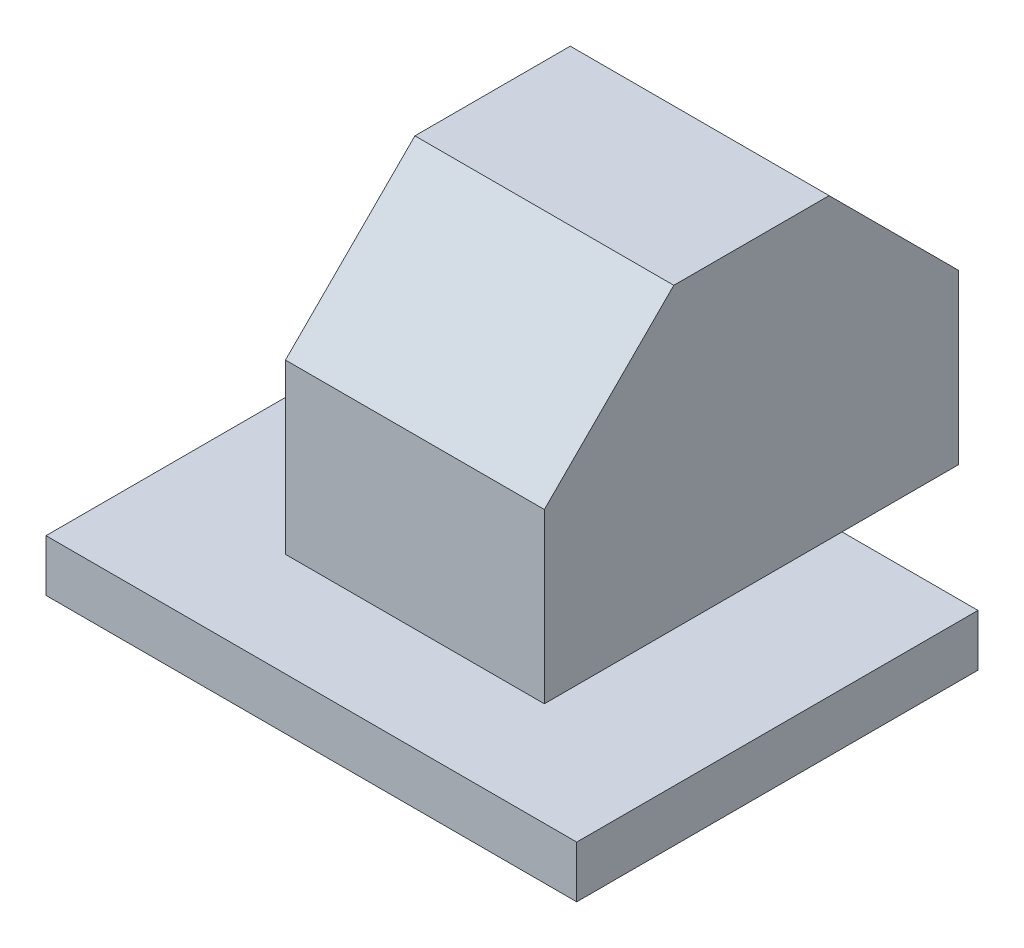
ISO-10303-21;
HEADER;
FILE_DESCRIPTION(('STEP AP214'),'2;1');
FILE_NAME('part.step','',(''),(''),'','','');
FILE_SCHEMA(('AUTOMOTIVE_DESIGN { 1 0 10303 214 1 1 1 1 }'));
ENDSEC;
DATA;
#1=APPLICATION_CONTEXT('core data for automotive mechanical design processes');
#2=APPLICATION_PROTOCOL_DEFINITION('international standard','automotive_design',2000,#1);
#3=PRODUCT_CONTEXT('',#1,'mechanical');
#4=PRODUCT('Part','Part','',(#3));
#5=PRODUCT_RELATED_PRODUCT_CATEGORY('part','',(#4));
#6=PRODUCT_DEFINITION_FORMATION('','',#4);
#7=PRODUCT_DEFINITION_CONTEXT('part definition',#1,'design');
#8=PRODUCT_DEFINITION('design','',#6,#7);
#9=PRODUCT_DEFINITION_SHAPE('','',#8);
#10=(LENGTH_UNIT() NAMED_UNIT(*) SI_UNIT(.MILLI.,.METRE.));
#11=(NAMED_UNIT(*) PLANE_ANGLE_UNIT() SI_UNIT($,.RADIAN.));
#12=(NAMED_UNIT(*) SI_UNIT($,.STERADIAN.) SOLID_ANGLE_UNIT());
#13=UNCERTAINTY_MEASURE_WITH_UNIT(LENGTH_MEASURE(1.E-05),#10,'distance_accuracy_value','');
#14=(GEOMETRIC_REPRESENTATION_CONTEXT(3) GLOBAL_UNCERTAINTY_ASSIGNED_CONTEXT((#13)) GLOBAL_UNIT_ASSIGNED_CONTEXT((#10,
#11,#12)) REPRESENTATION_CONTEXT('',''));
#15=CARTESIAN_POINT('',(0.,0.,0.));
#16=DIRECTION('',(0.,0.,1.));
#17=DIRECTION('',(1.,0.,0.));
#18=AXIS2_PLACEMENT_3D('',#15,#16,#17);
#19=CARTESIAN_POINT('',(0.,2.,0.));
#20=DIRECTION('',(0.,-1.,0.));
#21=DIRECTION('',(0.,0.,-1.));
#22=AXIS2_PLACEMENT_3D('',#19,#20,#21);
#23=PLANE('',#22);
#24=CARTESIAN_POINT('',(-8.64441072293235,2.,-4.98118974526797));
#25=DIRECTION('',(0.,-1.,0.));
#26=DIRECTION('',(0.,0.,-1.));
#27=AXIS2_PLACEMENT_3D('',#24,#25,#26);
#28=CIRCLE('',#27,1.43812907012534);
#29=CARTESIAN_POINT('',(-8.64441072293235,2.,-6.41931881539331));
#30=VERTEX_POINT('',#29);
#31=EDGE_CURVE('E194',#30,#30,#28,.F.);
#32=ORIENTED_EDGE('',*,*,#31,.F.);
#33=EDGE_LOOP('',(#32));
#34=FACE_BOUND('',#33,.T.);
#35=DIRECTION('',(0.,0.,1.));
#36=VECTOR('',#35,1.);
#37=CARTESIAN_POINT('',(-5.,2.,3.75));
#38=LINE('',#37,#36);
#39=CARTESIAN_POINT('',(-5.,2.,-7.75));
#40=VERTEX_POINT('',#39);
#41=CARTESIAN_POINT('',(-5.,2.,3.75));
#42=VERTEX_POINT('',#41);
#43=EDGE_CURVE('E152',#40,#42,#38,.T.);
#44=ORIENTED_EDGE('',*,*,#43,.F.);
#45=DIRECTION('',(-1.,0.,0.));
#46=VECTOR('',#45,1.);
#47=CARTESIAN_POINT('',(10.25,2.,-7.75));
#48=LINE('',#47,#46);
#49=CARTESIAN_POINT('',(-10.25,2.,-7.75));
#50=VERTEX_POINT('',#49);
#51=EDGE_CURVE('E172',#40,#50,#48,.T.);
#52=ORIENTED_EDGE('',*,*,#51,.T.);
#53=DIRECTION('',(0.,0.,1.));
#54=VECTOR('',#53,1.);
#55=CARTESIAN_POINT('',(-10.25,2.,-7.75));
#56=LINE('',#55,#54);
#57=CARTESIAN_POINT('',(-10.25,2.,7.75));
#58=VERTEX_POINT('',#57);
#59=EDGE_CURVE('E164',#50,#58,#56,.T.);
#60=ORIENTED_EDGE('',*,*,#59,.T.);
#61=DIRECTION('',(1.,0.,0.));
#62=VECTOR('',#61,1.);
#63=CARTESIAN_POINT('',(10.25,2.,7.75));
#64=LINE('',#63,#62);
#65=CARTESIAN_POINT('',(10.25,2.,7.75));
#66=VERTEX_POINT('',#65);
#67=EDGE_CURVE('E167',#58,#66,#64,.T.);
#68=ORIENTED_EDGE('',*,*,#67,.T.);
#69=DIRECTION('',(0.,0.,-1.));
#70=VECTOR('',#69,1.);
#71=CARTESIAN_POINT('',(10.25,2.,-7.75));
#72=LINE('',#71,#70);
#73=CARTESIAN_POINT('',(10.25,2.,-7.75));
#74=VERTEX_POINT('',#73);
#75=EDGE_CURVE('E170',#66,#74,#72,.T.);
#76=ORIENTED_EDGE('',*,*,#75,.T.);
#77=CARTESIAN_POINT('',(5.,2.,-7.75));
#78=VERTEX_POINT('',#77);
#79=EDGE_CURVE('E140',#74,#78,#48,.T.);
#80=ORIENTED_EDGE('',*,*,#79,.T.);
#81=DIRECTION('',(0.,0.,-1.));
#82=VECTOR('',#81,1.);
#83=CARTESIAN_POINT('',(5.,2.,3.75));
#84=LINE('',#83,#82);
#85=CARTESIAN_POINT('',(5.,2.,3.75));
#86=VERTEX_POINT('',#85);
#87=EDGE_CURVE('E127',#86,#78,#84,.T.);
#88=ORIENTED_EDGE('',*,*,#87,.F.);
#89=DIRECTION('',(1.,0.,0.));
#90=VECTOR('',#89,1.);
#91=CARTESIAN_POINT('',(5.,2.,3.75));
#92=LINE('',#91,#90);
#93=EDGE_CURVE('E137',#42,#86,#92,.T.);
#94=ORIENTED_EDGE('',*,*,#93,.F.);
#95=EDGE_LOOP('',(#44,#52,#60,#68,#76,#80,#88,#94));
#96=FACE_BOUND('',#95,.T.);
#97=ADVANCED_FACE('F41',(#34,#96),#23,.F.);
#98=CARTESIAN_POINT('',(-10.25,2.,-7.75));
#99=DIRECTION('',(1.,0.,0.));
#100=DIRECTION('',(0.,0.,-1.));
#101=AXIS2_PLACEMENT_3D('',#98,#99,#100);
#102=PLANE('',#101);
#103=DIRECTION('',(0.,0.,1.));
#104=VECTOR('',#103,1.);
#105=CARTESIAN_POINT('',(-10.25,0.,-7.75));
#106=LINE('',#105,#104);
#107=CARTESIAN_POINT('',(-10.25,0.,-7.75));
#108=VERTEX_POINT('',#107);
#109=CARTESIAN_POINT('',(-10.25,0.,7.75));
#110=VERTEX_POINT('',#109);
#111=EDGE_CURVE('E163',#108,#110,#106,.T.);
#112=ORIENTED_EDGE('',*,*,#111,.T.);
#113=DIRECTION('',(0.,-1.,0.));
#114=VECTOR('',#113,1.);
#115=CARTESIAN_POINT('',(-10.25,2.,7.75));
#116=LINE('',#115,#114);
#117=EDGE_CURVE('E191',#58,#110,#116,.T.);
#118=ORIENTED_EDGE('',*,*,#117,.F.);
#119=ORIENTED_EDGE('',*,*,#59,.F.);
#120=DIRECTION('',(0.,-1.,0.));
#121=VECTOR('',#120,1.);
#122=CARTESIAN_POINT('',(-10.25,2.,-7.75));
#123=LINE('',#122,#121);
#124=EDGE_CURVE('E174',#50,#108,#123,.T.);
#125=ORIENTED_EDGE('',*,*,#124,.T.);
#126=EDGE_LOOP('',(#112,#118,#119,#125));
#127=FACE_BOUND('',#126,.T.);
#128=ADVANCED_FACE('F236',(#127),#102,.F.);
#129=CARTESIAN_POINT('',(10.25,2.,7.75));
#130=DIRECTION('',(0.,0.,-1.));
#131=DIRECTION('',(-1.,0.,0.));
#132=AXIS2_PLACEMENT_3D('',#129,#130,#131);
#133=PLANE('',#132);
#134=DIRECTION('',(1.,0.,0.));
#135=VECTOR('',#134,1.);
#136=CARTESIAN_POINT('',(10.25,0.,7.75));
#137=LINE('',#136,#135);
#138=CARTESIAN_POINT('',(10.25,0.,7.75));
#139=VERTEX_POINT('',#138);
#140=EDGE_CURVE('E178',#110,#139,#137,.T.);
#141=ORIENTED_EDGE('',*,*,#140,.T.);
#142=DIRECTION('',(0.,-1.,0.));
#143=VECTOR('',#142,1.);
#144=CARTESIAN_POINT('',(10.25,2.,7.75));
#145=LINE('',#144,#143);
#146=EDGE_CURVE('E188',#66,#139,#145,.T.);
#147=ORIENTED_EDGE('',*,*,#146,.F.);
#148=ORIENTED_EDGE('',*,*,#67,.F.);
#149=ORIENTED_EDGE('',*,*,#117,.T.);
#150=EDGE_LOOP('',(#141,#147,#148,#149));
#151=FACE_BOUND('',#150,.T.);
#152=ADVANCED_FACE('F241',(#151),#133,.F.);
#153=CARTESIAN_POINT('',(10.25,2.,-7.75));
#154=DIRECTION('',(-1.,0.,0.));
#155=DIRECTION('',(0.,0.,1.));
#156=AXIS2_PLACEMENT_3D('',#153,#154,#155);
#157=PLANE('',#156);
#158=DIRECTION('',(0.,0.,-1.));
#159=VECTOR('',#158,1.);
#160=CARTESIAN_POINT('',(10.25,0.,-7.75));
#161=LINE('',#160,#159);
#162=CARTESIAN_POINT('',(10.25,0.,-7.75));
#163=VERTEX_POINT('',#162);
#164=EDGE_CURVE('E180',#139,#163,#161,.T.);
#165=ORIENTED_EDGE('',*,*,#164,.T.);
#166=DIRECTION('',(0.,-1.,0.));
#167=VECTOR('',#166,1.);
#168=CARTESIAN_POINT('',(10.25,2.,-7.75));
#169=LINE('',#168,#167);
#170=EDGE_CURVE('E185',#74,#163,#169,.T.);
#171=ORIENTED_EDGE('',*,*,#170,.F.);
#172=ORIENTED_EDGE('',*,*,#75,.F.);
#173=ORIENTED_EDGE('',*,*,#146,.T.);
#174=EDGE_LOOP('',(#165,#171,#172,#173));
#175=FACE_BOUND('',#174,.T.);
#176=ADVANCED_FACE('F244',(#175),#157,.F.);
#177=CARTESIAN_POINT('',(10.25,2.,-7.75));
#178=DIRECTION('',(0.,0.,1.));
#179=DIRECTION('',(1.,0.,0.));
#180=AXIS2_PLACEMENT_3D('',#177,#178,#179);
#181=PLANE('',#180);
#182=DIRECTION('',(-1.,0.,0.));
#183=VECTOR('',#182,1.);
#184=CARTESIAN_POINT('',(10.25,0.,-7.75));
#185=LINE('',#184,#183);
#186=EDGE_CURVE('E168',#163,#108,#185,.T.);
#187=ORIENTED_EDGE('',*,*,#186,.T.);
#188=ORIENTED_EDGE('',*,*,#124,.F.);
#189=ORIENTED_EDGE('',*,*,#51,.F.);
#190=EDGE_CURVE('E175',#78,#40,#48,.T.);
#191=ORIENTED_EDGE('',*,*,#190,.F.);
#192=ORIENTED_EDGE('',*,*,#79,.F.);
#193=ORIENTED_EDGE('',*,*,#170,.T.);
#194=EDGE_LOOP('',(#187,#188,#189,#191,#192,#193));
#195=FACE_BOUND('',#194,.T.);
#196=ADVANCED_FACE('F230',(#195),#181,.F.);
#197=CARTESIAN_POINT('',(0.,0.,0.));
#198=DIRECTION('',(0.,-1.,0.));
#199=DIRECTION('',(0.,0.,-1.));
#200=AXIS2_PLACEMENT_3D('',#197,#198,#199);
#201=PLANE('',#200);
#202=ORIENTED_EDGE('',*,*,#111,.F.);
#203=ORIENTED_EDGE('',*,*,#186,.F.);
#204=ORIENTED_EDGE('',*,*,#164,.F.);
#205=ORIENTED_EDGE('',*,*,#140,.F.);
#206=EDGE_LOOP('',(#202,#203,#204,#205));
#207=FACE_BOUND('',#206,.T.);
#208=ADVANCED_FACE('F246',(#207),#201,.T.);
#209=CARTESIAN_POINT('',(0.,2.,0.));
#210=DIRECTION('',(0.,1.,0.));
#211=DIRECTION('',(0.,0.,1.));
#212=AXIS2_PLACEMENT_3D('',#209,#210,#211);
#213=PLANE('',#212);
#214=CARTESIAN_POINT('',(5.,2.,-12.25));
#215=VERTEX_POINT('',#214);
#216=EDGE_CURVE('E143',#78,#215,#84,.T.);
#217=ORIENTED_EDGE('',*,*,#216,.F.);
#218=ORIENTED_EDGE('',*,*,#190,.T.);
#219=CARTESIAN_POINT('',(-5.,2.,-12.25));
#220=VERTEX_POINT('',#219);
#221=EDGE_CURVE('E147',#220,#40,#38,.T.);
#222=ORIENTED_EDGE('',*,*,#221,.F.);
#223=DIRECTION('',(-1.,0.,0.));
#224=VECTOR('',#223,1.);
#225=CARTESIAN_POINT('',(5.,2.,-12.25));
#226=LINE('',#225,#224);
#227=EDGE_CURVE('E142',#215,#220,#226,.T.);
#228=ORIENTED_EDGE('',*,*,#227,.F.);
#229=EDGE_LOOP('',(#217,#218,#222,#228));
#230=FACE_BOUND('',#229,.T.);
#231=ADVANCED_FACE('F225',(#230),#213,.F.);
#232=CARTESIAN_POINT('',(-5.,13.5,3.75));
#233=DIRECTION('',(1.,0.,0.));
#234=DIRECTION('',(0.,0.,-1.));
#235=AXIS2_PLACEMENT_3D('',#232,#233,#234);
#236=PLANE('',#235);
#237=DIRECTION('',(0.,0.,1.));
#238=VECTOR('',#237,1.);
#239=CARTESIAN_POINT('',(-5.,13.5,3.75));
#240=LINE('',#239,#238);
#241=CARTESIAN_POINT('',(-5.,13.5,-7.25000000000001));
#242=VERTEX_POINT('',#241);
#243=CARTESIAN_POINT('',(-5.,13.5,-1.25));
#244=VERTEX_POINT('',#243);
#245=EDGE_CURVE('E157',#242,#244,#240,.T.);
#246=ORIENTED_EDGE('',*,*,#245,.F.);
#247=DIRECTION('',(0.,-0.707106781186549,-0.707106781186546));
#248=VECTOR('',#247,1.);
#249=CARTESIAN_POINT('',(-5.,13.5,-7.25000000000001));
#250=LINE('',#249,#248);
#251=CARTESIAN_POINT('',(-5.,8.49999999999999,-12.25));
#252=VERTEX_POINT('',#251);
#253=EDGE_CURVE('E205',#242,#252,#250,.T.);
#254=ORIENTED_EDGE('',*,*,#253,.T.);
#255=DIRECTION('',(0.,-1.,0.));
#256=VECTOR('',#255,1.);
#257=CARTESIAN_POINT('',(-5.,13.5,-12.25));
#258=LINE('',#257,#256);
#259=EDGE_CURVE('E158',#252,#220,#258,.T.);
#260=ORIENTED_EDGE('',*,*,#259,.T.);
#261=ORIENTED_EDGE('',*,*,#221,.T.);
#262=ORIENTED_EDGE('',*,*,#43,.T.);
#263=DIRECTION('',(0.,-1.,0.));
#264=VECTOR('',#263,1.);
#265=CARTESIAN_POINT('',(-5.,13.5,3.75));
#266=LINE('',#265,#264);
#267=CARTESIAN_POINT('',(-5.,8.49999999999999,3.75));
#268=VERTEX_POINT('',#267);
#269=EDGE_CURVE('E131',#268,#42,#266,.T.);
#270=ORIENTED_EDGE('',*,*,#269,.F.);
#271=DIRECTION('',(0.,0.707106781186549,-0.707106781186546));
#272=VECTOR('',#271,1.);
#273=CARTESIAN_POINT('',(-5.,13.5,-1.25));
#274=LINE('',#273,#272);
#275=EDGE_CURVE('E203',#268,#244,#274,.T.);
#276=ORIENTED_EDGE('',*,*,#275,.T.);
#277=EDGE_LOOP('',(#246,#254,#260,#261,#262,#270,#276));
#278=FACE_BOUND('',#277,.T.);
#279=ADVANCED_FACE('F219',(#278),#236,.F.);
#280=CARTESIAN_POINT('',(5.,13.5,3.75));
#281=DIRECTION('',(0.,0.,-1.));
#282=DIRECTION('',(-1.,0.,0.));
#283=AXIS2_PLACEMENT_3D('',#280,#281,#282);
#284=PLANE('',#283);
#285=DIRECTION('',(0.,-1.,0.));
#286=VECTOR('',#285,1.);
#287=CARTESIAN_POINT('',(5.,13.5,3.75));
#288=LINE('',#287,#286);
#289=CARTESIAN_POINT('',(5.,8.49999999999999,3.75));
#290=VERTEX_POINT('',#289);
#291=EDGE_CURVE('E123',#290,#86,#288,.T.);
#292=ORIENTED_EDGE('',*,*,#291,.F.);
#293=DIRECTION('',(-1.,0.,0.));
#294=VECTOR('',#293,1.);
#295=CARTESIAN_POINT('',(-5.,8.49999999999999,3.75));
#296=LINE('',#295,#294);
#297=EDGE_CURVE('E11',#290,#268,#296,.T.);
#298=ORIENTED_EDGE('',*,*,#297,.T.);
#299=ORIENTED_EDGE('',*,*,#269,.T.);
#300=ORIENTED_EDGE('',*,*,#93,.T.);
#301=EDGE_LOOP('',(#292,#298,#299,#300));
#302=FACE_BOUND('',#301,.T.);
#303=ADVANCED_FACE('F145',(#302),#284,.F.);
#304=CARTESIAN_POINT('',(5.,13.5,3.75));
#305=DIRECTION('',(-1.,0.,0.));
#306=DIRECTION('',(0.,0.,1.));
#307=AXIS2_PLACEMENT_3D('',#304,#305,#306);
#308=PLANE('',#307);
#309=DIRECTION('',(0.,-1.,0.));
#310=VECTOR('',#309,1.);
#311=CARTESIAN_POINT('',(5.,13.5,-12.25));
#312=LINE('',#311,#310);
#313=CARTESIAN_POINT('',(5.,8.49999999999999,-12.25));
#314=VERTEX_POINT('',#313);
#315=EDGE_CURVE('E132',#314,#215,#312,.T.);
#316=ORIENTED_EDGE('',*,*,#315,.F.);
#317=DIRECTION('',(0.,0.707106781186549,0.707106781186546));
#318=VECTOR('',#317,1.);
#319=CARTESIAN_POINT('',(5.,13.5,-7.25000000000001));
#320=LINE('',#319,#318);
#321=CARTESIAN_POINT('',(5.,13.5,-7.25000000000001));
#322=VERTEX_POINT('',#321);
#323=EDGE_CURVE('E50',#314,#322,#320,.T.);
#324=ORIENTED_EDGE('',*,*,#323,.T.);
#325=DIRECTION('',(0.,0.,-1.));
#326=VECTOR('',#325,1.);
#327=CARTESIAN_POINT('',(5.,13.5,3.75));
#328=LINE('',#327,#326);
#329=CARTESIAN_POINT('',(5.,13.5,-1.25));
#330=VERTEX_POINT('',#329);
#331=EDGE_CURVE('E160',#330,#322,#328,.T.);
#332=ORIENTED_EDGE('',*,*,#331,.F.);
#333=DIRECTION('',(0.,-0.707106781186549,0.707106781186546));
#334=VECTOR('',#333,1.);
#335=CARTESIAN_POINT('',(5.,13.5,-1.25));
#336=LINE('',#335,#334);
#337=EDGE_CURVE('E57',#330,#290,#336,.T.);
#338=ORIENTED_EDGE('',*,*,#337,.T.);
#339=ORIENTED_EDGE('',*,*,#291,.T.);
#340=ORIENTED_EDGE('',*,*,#87,.T.);
#341=ORIENTED_EDGE('',*,*,#216,.T.);
#342=EDGE_LOOP('',(#316,#324,#332,#338,#339,#340,#341));
#343=FACE_BOUND('',#342,.T.);
#344=ADVANCED_FACE('F125',(#343),#308,.F.);
#345=CARTESIAN_POINT('',(5.,13.5,-12.25));
#346=DIRECTION('',(0.,0.,1.));
#347=DIRECTION('',(1.,0.,0.));
#348=AXIS2_PLACEMENT_3D('',#345,#346,#347);
#349=PLANE('',#348);
#350=ORIENTED_EDGE('',*,*,#259,.F.);
#351=DIRECTION('',(1.,0.,0.));
#352=VECTOR('',#351,1.);
#353=CARTESIAN_POINT('',(5.,8.49999999999999,-12.25));
#354=LINE('',#353,#352);
#355=EDGE_CURVE('E65',#252,#314,#354,.T.);
#356=ORIENTED_EDGE('',*,*,#355,.T.);
#357=ORIENTED_EDGE('',*,*,#315,.T.);
#358=ORIENTED_EDGE('',*,*,#227,.T.);
#359=EDGE_LOOP('',(#350,#356,#357,#358));
#360=FACE_BOUND('',#359,.T.);
#361=ADVANCED_FACE('F220',(#360),#349,.F.);
#362=CARTESIAN_POINT('',(0.,13.5,0.));
#363=DIRECTION('',(0.,1.,0.));
#364=DIRECTION('',(0.,0.,1.));
#365=AXIS2_PLACEMENT_3D('',#362,#363,#364);
#366=PLANE('',#365);
#367=ORIENTED_EDGE('',*,*,#331,.T.);
#368=DIRECTION('',(-1.,0.,0.));
#369=VECTOR('',#368,1.);
#370=CARTESIAN_POINT('',(-5.,13.5,-7.25000000000001));
#371=LINE('',#370,#369);
#372=EDGE_CURVE('E200',#322,#242,#371,.T.);
#373=ORIENTED_EDGE('',*,*,#372,.T.);
#374=ORIENTED_EDGE('',*,*,#245,.T.);
#375=DIRECTION('',(1.,0.,0.));
#376=VECTOR('',#375,1.);
#377=CARTESIAN_POINT('',(5.,13.5,-1.25));
#378=LINE('',#377,#376);
#379=EDGE_CURVE('E197',#244,#330,#378,.T.);
#380=ORIENTED_EDGE('',*,*,#379,.T.);
#381=EDGE_LOOP('',(#367,#373,#374,#380));
#382=FACE_BOUND('',#381,.T.);
#383=ADVANCED_FACE('F213',(#382),#366,.T.);
#384=CARTESIAN_POINT('',(-8.64441072293235,3.5,-4.98118974526797));
#385=DIRECTION('',(0.,-1.,0.));
#386=DIRECTION('',(0.,0.,-1.));
#387=AXIS2_PLACEMENT_3D('',#384,#385,#386);
#388=CYLINDRICAL_SURFACE('',#387,1.43812907012534);
#389=CARTESIAN_POINT('',(-8.64441072293235,3.5,-4.98118974526797));
#390=DIRECTION('',(0.,1.,0.));
#391=DIRECTION('',(0.,0.,1.));
#392=AXIS2_PLACEMENT_3D('',#389,#390,#391);
#393=CIRCLE('',#392,1.43812907012534);
#394=CARTESIAN_POINT('',(-8.64441072293235,3.5,-3.54306067514262));
#395=VERTEX_POINT('',#394);
#396=EDGE_CURVE('E150',#395,#395,#393,.T.);
#397=ORIENTED_EDGE('',*,*,#396,.F.);
#398=EDGE_LOOP('',(#397));
#399=FACE_BOUND('',#398,.T.);
#400=ORIENTED_EDGE('',*,*,#31,.T.);
#401=EDGE_LOOP('',(#400));
#402=FACE_BOUND('',#401,.T.);
#403=ADVANCED_FACE('F274',(#399,#402),#388,.T.);
#404=CARTESIAN_POINT('',(-8.64441072293235,3.5,-4.98118974526797));
#405=DIRECTION('',(0.,1.,0.));
#406=DIRECTION('',(0.,0.,1.));
#407=AXIS2_PLACEMENT_3D('',#404,#405,#406);
#408=PLANE('',#407);
#409=ORIENTED_EDGE('',*,*,#396,.T.);
#410=EDGE_LOOP('',(#409));
#411=FACE_BOUND('',#410,.T.);
#412=ADVANCED_FACE('F277',(#411),#408,.T.);
#413=CARTESIAN_POINT('',(0.,13.5,-7.25000000000001));
#414=DIRECTION('',(0.,0.707106781186546,-0.707106781186549));
#415=DIRECTION('',(1.,0.,0.));
#416=AXIS2_PLACEMENT_3D('',#413,#414,#415);
#417=PLANE('',#416);
#418=ORIENTED_EDGE('',*,*,#323,.F.);
#419=ORIENTED_EDGE('',*,*,#355,.F.);
#420=ORIENTED_EDGE('',*,*,#253,.F.);
#421=ORIENTED_EDGE('',*,*,#372,.F.);
#422=EDGE_LOOP('',(#418,#419,#420,#421));
#423=FACE_BOUND('',#422,.T.);
#424=ADVANCED_FACE('F217',(#423),#417,.T.);
#425=CARTESIAN_POINT('',(0.,13.5,-1.25));
#426=DIRECTION('',(0.,0.707106781186546,0.707106781186549));
#427=DIRECTION('',(-1.,0.,0.));
#428=AXIS2_PLACEMENT_3D('',#425,#426,#427);
#429=PLANE('',#428);
#430=ORIENTED_EDGE('',*,*,#275,.F.);
#431=ORIENTED_EDGE('',*,*,#297,.F.);
#432=ORIENTED_EDGE('',*,*,#337,.F.);
#433=ORIENTED_EDGE('',*,*,#379,.F.);
#434=EDGE_LOOP('',(#430,#431,#432,#433));
#435=FACE_BOUND('',#434,.T.);
#436=ADVANCED_FACE('F44',(#435),#429,.T.);
#437=CLOSED_SHELL('',(#97,#128,#152,#176,#196,#208,#231,#279,#303,#344,#361,#383,#403,#412,#424,#436));
#438=MANIFOLD_SOLID_BREP('B2',#437);
#439=ADVANCED_BREP_SHAPE_REPRESENTATION('',(#18,#438),#14);
#440=SHAPE_DEFINITION_REPRESENTATION(#9,#439);
ENDSEC;
END-ISO-10303-21;
